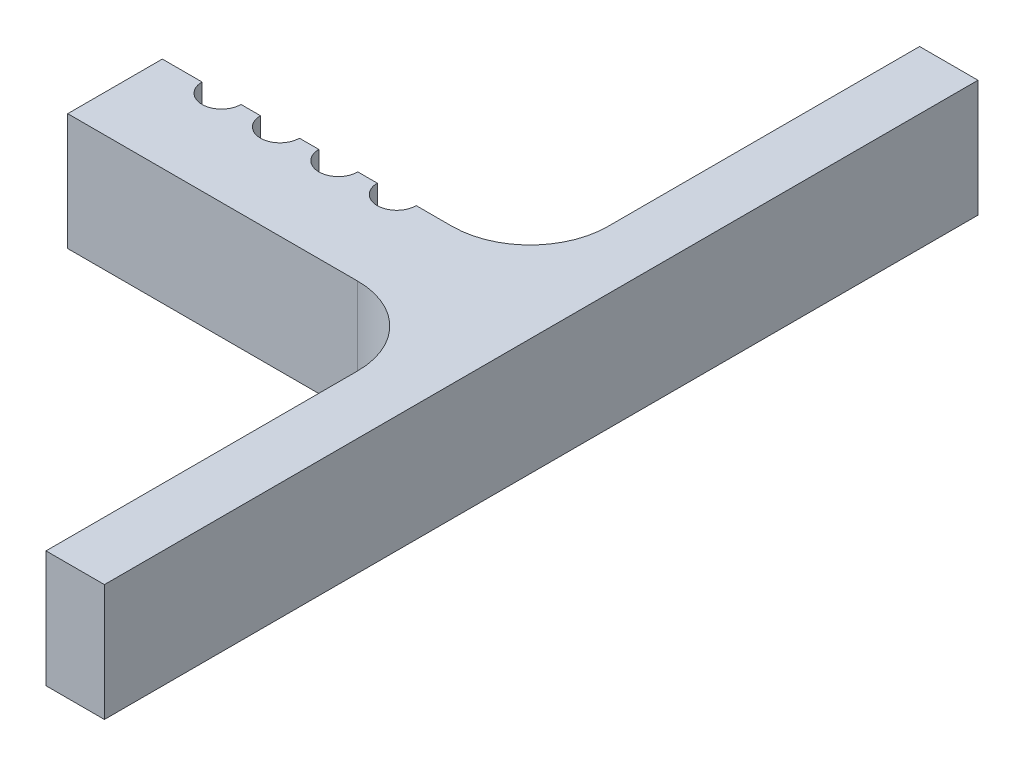
ISO-10303-21;
HEADER;
FILE_DESCRIPTION(('STEP AP214'),'2;1');
FILE_NAME('part.step','',(''),(''),'','','');
FILE_SCHEMA(('AUTOMOTIVE_DESIGN { 1 0 10303 214 1 1 1 1 }'));
ENDSEC;
DATA;
#1=APPLICATION_CONTEXT('core data for automotive mechanical design processes');
#2=APPLICATION_PROTOCOL_DEFINITION('international standard','automotive_design',2000,#1);
#3=PRODUCT_CONTEXT('',#1,'mechanical');
#4=PRODUCT('Part','Part','',(#3));
#5=PRODUCT_RELATED_PRODUCT_CATEGORY('part','',(#4));
#6=PRODUCT_DEFINITION_FORMATION('','',#4);
#7=PRODUCT_DEFINITION_CONTEXT('part definition',#1,'design');
#8=PRODUCT_DEFINITION('design','',#6,#7);
#9=PRODUCT_DEFINITION_SHAPE('','',#8);
#10=(LENGTH_UNIT() NAMED_UNIT(*) SI_UNIT(.MILLI.,.METRE.));
#11=(NAMED_UNIT(*) PLANE_ANGLE_UNIT() SI_UNIT($,.RADIAN.));
#12=(NAMED_UNIT(*) SI_UNIT($,.STERADIAN.) SOLID_ANGLE_UNIT());
#13=UNCERTAINTY_MEASURE_WITH_UNIT(LENGTH_MEASURE(1.E-05),#10,'distance_accuracy_value','');
#14=(GEOMETRIC_REPRESENTATION_CONTEXT(3) GLOBAL_UNCERTAINTY_ASSIGNED_CONTEXT((#13)) GLOBAL_UNIT_ASSIGNED_CONTEXT((#10,
#11,#12)) REPRESENTATION_CONTEXT('',''));
#15=CARTESIAN_POINT('',(0.,0.,0.));
#16=DIRECTION('',(0.,0.,1.));
#17=DIRECTION('',(1.,0.,0.));
#18=AXIS2_PLACEMENT_3D('',#15,#16,#17);
#19=CARTESIAN_POINT('',(0.,1.5,-10.2213378490945));
#20=DIRECTION('',(0.,0.,-1.));
#21=DIRECTION('',(-1.,0.,0.));
#22=AXIS2_PLACEMENT_3D('',#19,#20,#21);
#23=PLANE('',#22);
#24=DIRECTION('',(1.,0.,0.));
#25=VECTOR('',#24,1.);
#26=CARTESIAN_POINT('',(0.,1.5,-10.2213378490945));
#27=LINE('',#26,#25);
#28=CARTESIAN_POINT('',(-43.5465527936732,1.5,-10.2213378490945));
#29=VERTEX_POINT('',#28);
#30=CARTESIAN_POINT('',(-43.0852713193559,1.5,-10.2213378490945));
#31=VERTEX_POINT('',#30);
#32=EDGE_CURVE('E185',#29,#31,#27,.T.);
#33=ORIENTED_EDGE('',*,*,#32,.T.);
#34=DIRECTION('',(0.,-1.,0.));
#35=VECTOR('',#34,1.);
#36=CARTESIAN_POINT('',(-43.0852713193559,0.,-10.2213378490945));
#37=LINE('',#36,#35);
#38=CARTESIAN_POINT('',(-43.0852713193559,0.,-10.2213378490945));
#39=VERTEX_POINT('',#38);
#40=EDGE_CURVE('E247',#31,#39,#37,.T.);
#41=ORIENTED_EDGE('',*,*,#40,.T.);
#42=DIRECTION('',(1.,0.,0.));
#43=VECTOR('',#42,1.);
#44=CARTESIAN_POINT('',(0.,0.,-10.2213378490945));
#45=LINE('',#44,#43);
#46=CARTESIAN_POINT('',(-43.5465527936732,0.,-10.2213378490945));
#47=VERTEX_POINT('',#46);
#48=EDGE_CURVE('E56',#47,#39,#45,.T.);
#49=ORIENTED_EDGE('',*,*,#48,.F.);
#50=DIRECTION('',(0.,1.,0.));
#51=VECTOR('',#50,1.);
#52=CARTESIAN_POINT('',(-43.5465527936732,-0.5,-10.2213378490945));
#53=LINE('',#52,#51);
#54=EDGE_CURVE('E42',#47,#29,#53,.T.);
#55=ORIENTED_EDGE('',*,*,#54,.T.);
#56=EDGE_LOOP('',(#33,#41,#49,#55));
#57=FACE_BOUND('',#56,.T.);
#58=ADVANCED_FACE('F34',(#57),#23,.T.);
#59=CARTESIAN_POINT('',(-43.7965527936732,-0.5,-10.2213378490945));
#60=DIRECTION('',(0.,1.,0.));
#61=DIRECTION('',(0.,0.,1.));
#62=AXIS2_PLACEMENT_3D('',#59,#60,#61);
#63=CYLINDRICAL_SURFACE('',#62,0.25);
#64=DIRECTION('',(0.,1.,0.));
#65=VECTOR('',#64,1.);
#66=CARTESIAN_POINT('',(-44.0465527936732,-0.5,-10.2213378490945));
#67=LINE('',#66,#65);
#68=CARTESIAN_POINT('',(-44.0465527936732,0.,-10.2213378490945));
#69=VERTEX_POINT('',#68);
#70=CARTESIAN_POINT('',(-44.0465527936732,1.5,-10.2213378490945));
#71=VERTEX_POINT('',#70);
#72=EDGE_CURVE('E194',#69,#71,#67,.T.);
#73=ORIENTED_EDGE('',*,*,#72,.T.);
#74=CARTESIAN_POINT('',(-43.7965527936732,1.5,-10.2213378490945));
#75=DIRECTION('',(0.,1.,0.));
#76=DIRECTION('',(0.,0.,1.));
#77=AXIS2_PLACEMENT_3D('',#74,#75,#76);
#78=CIRCLE('',#77,0.25);
#79=EDGE_CURVE('E233',#71,#29,#78,.T.);
#80=ORIENTED_EDGE('',*,*,#79,.T.);
#81=ORIENTED_EDGE('',*,*,#54,.F.);
#82=CARTESIAN_POINT('',(-43.7965527936732,0.,-10.2213378490945));
#83=DIRECTION('',(0.,1.,0.));
#84=DIRECTION('',(0.,0.,1.));
#85=AXIS2_PLACEMENT_3D('',#82,#83,#84);
#86=CIRCLE('',#85,0.25);
#87=EDGE_CURVE('E11',#69,#47,#86,.T.);
#88=ORIENTED_EDGE('',*,*,#87,.F.);
#89=EDGE_LOOP('',(#73,#80,#81,#88));
#90=FACE_BOUND('',#89,.T.);
#91=ADVANCED_FACE('F36',(#90),#63,.F.);
#92=CARTESIAN_POINT('',(-44.2965527936732,1.5,-10.2213378490945));
#93=VERTEX_POINT('',#92);
#94=EDGE_CURVE('E192',#93,#71,#27,.T.);
#95=ORIENTED_EDGE('',*,*,#94,.T.);
#96=ORIENTED_EDGE('',*,*,#72,.F.);
#97=CARTESIAN_POINT('',(-44.2965527936732,0.,-10.2213378490945));
#98=VERTEX_POINT('',#97);
#99=EDGE_CURVE('E48',#98,#69,#45,.T.);
#100=ORIENTED_EDGE('',*,*,#99,.F.);
#101=DIRECTION('',(0.,1.,0.));
#102=VECTOR('',#101,1.);
#103=CARTESIAN_POINT('',(-44.2965527936732,-0.5,-10.2213378490945));
#104=LINE('',#103,#102);
#105=EDGE_CURVE('E197',#98,#93,#104,.T.);
#106=ORIENTED_EDGE('',*,*,#105,.T.);
#107=EDGE_LOOP('',(#95,#96,#100,#106));
#108=FACE_BOUND('',#107,.T.);
#109=ADVANCED_FACE('F349',(#108),#23,.T.);
#110=CARTESIAN_POINT('',(-44.5465527936732,-0.5,-10.2213378490945));
#111=DIRECTION('',(0.,1.,0.));
#112=DIRECTION('',(0.,0.,1.));
#113=AXIS2_PLACEMENT_3D('',#110,#111,#112);
#114=CYLINDRICAL_SURFACE('',#113,0.25);
#115=DIRECTION('',(0.,1.,0.));
#116=VECTOR('',#115,1.);
#117=CARTESIAN_POINT('',(-44.7965527936732,-0.5,-10.2213378490945));
#118=LINE('',#117,#116);
#119=CARTESIAN_POINT('',(-44.7965527936732,0.,-10.2213378490945));
#120=VERTEX_POINT('',#119);
#121=CARTESIAN_POINT('',(-44.7965527936732,1.5,-10.2213378490945));
#122=VERTEX_POINT('',#121);
#123=EDGE_CURVE('E203',#120,#122,#118,.T.);
#124=ORIENTED_EDGE('',*,*,#123,.T.);
#125=CARTESIAN_POINT('',(-44.5465527936732,1.5,-10.2213378490945));
#126=DIRECTION('',(0.,1.,0.));
#127=DIRECTION('',(0.,0.,1.));
#128=AXIS2_PLACEMENT_3D('',#125,#126,#127);
#129=CIRCLE('',#128,0.25);
#130=EDGE_CURVE('E228',#122,#93,#129,.T.);
#131=ORIENTED_EDGE('',*,*,#130,.T.);
#132=ORIENTED_EDGE('',*,*,#105,.F.);
#133=CARTESIAN_POINT('',(-44.5465527936732,0.,-10.2213378490945));
#134=DIRECTION('',(0.,1.,0.));
#135=DIRECTION('',(0.,0.,1.));
#136=AXIS2_PLACEMENT_3D('',#133,#134,#135);
#137=CIRCLE('',#136,0.25);
#138=EDGE_CURVE('E191',#120,#98,#137,.T.);
#139=ORIENTED_EDGE('',*,*,#138,.F.);
#140=EDGE_LOOP('',(#124,#131,#132,#139));
#141=FACE_BOUND('',#140,.T.);
#142=ADVANCED_FACE('F356',(#141),#114,.F.);
#143=CARTESIAN_POINT('',(-45.0465527936732,1.5,-10.2213378490945));
#144=VERTEX_POINT('',#143);
#145=EDGE_CURVE('E189',#144,#122,#27,.T.);
#146=ORIENTED_EDGE('',*,*,#145,.T.);
#147=ORIENTED_EDGE('',*,*,#123,.F.);
#148=CARTESIAN_POINT('',(-45.0465527936732,0.,-10.2213378490945));
#149=VERTEX_POINT('',#148);
#150=EDGE_CURVE('E204',#149,#120,#45,.T.);
#151=ORIENTED_EDGE('',*,*,#150,.F.);
#152=DIRECTION('',(0.,1.,0.));
#153=VECTOR('',#152,1.);
#154=CARTESIAN_POINT('',(-45.0465527936732,-0.5,-10.2213378490945));
#155=LINE('',#154,#153);
#156=EDGE_CURVE('E206',#149,#144,#155,.T.);
#157=ORIENTED_EDGE('',*,*,#156,.T.);
#158=EDGE_LOOP('',(#146,#147,#151,#157));
#159=FACE_BOUND('',#158,.T.);
#160=ADVANCED_FACE('F346',(#159),#23,.T.);
#161=CARTESIAN_POINT('',(-45.2965527936732,-0.5,-10.2213378490945));
#162=DIRECTION('',(0.,1.,0.));
#163=DIRECTION('',(0.,0.,1.));
#164=AXIS2_PLACEMENT_3D('',#161,#162,#163);
#165=CYLINDRICAL_SURFACE('',#164,0.25);
#166=DIRECTION('',(0.,1.,0.));
#167=VECTOR('',#166,1.);
#168=CARTESIAN_POINT('',(-45.5465527936732,-0.5,-10.2213378490945));
#169=LINE('',#168,#167);
#170=CARTESIAN_POINT('',(-45.5465527936732,0.,-10.2213378490945));
#171=VERTEX_POINT('',#170);
#172=CARTESIAN_POINT('',(-45.5465527936732,1.5,-10.2213378490945));
#173=VERTEX_POINT('',#172);
#174=EDGE_CURVE('E212',#171,#173,#169,.T.);
#175=ORIENTED_EDGE('',*,*,#174,.T.);
#176=CARTESIAN_POINT('',(-45.2965527936732,1.5,-10.2213378490945));
#177=DIRECTION('',(0.,1.,0.));
#178=DIRECTION('',(0.,0.,1.));
#179=AXIS2_PLACEMENT_3D('',#176,#177,#178);
#180=CIRCLE('',#179,0.25);
#181=EDGE_CURVE('E223',#173,#144,#180,.T.);
#182=ORIENTED_EDGE('',*,*,#181,.T.);
#183=ORIENTED_EDGE('',*,*,#156,.F.);
#184=CARTESIAN_POINT('',(-45.2965527936732,0.,-10.2213378490945));
#185=DIRECTION('',(0.,1.,0.));
#186=DIRECTION('',(0.,0.,1.));
#187=AXIS2_PLACEMENT_3D('',#184,#185,#186);
#188=CIRCLE('',#187,0.25);
#189=EDGE_CURVE('E199',#171,#149,#188,.T.);
#190=ORIENTED_EDGE('',*,*,#189,.F.);
#191=EDGE_LOOP('',(#175,#182,#183,#190));
#192=FACE_BOUND('',#191,.T.);
#193=ADVANCED_FACE('F343',(#192),#165,.F.);
#194=DIRECTION('',(0.,1.,0.));
#195=VECTOR('',#194,1.);
#196=CARTESIAN_POINT('',(-46.2965527936732,-0.5,-10.2213378490945));
#197=LINE('',#196,#195);
#198=CARTESIAN_POINT('',(-46.2965527936732,0.,-10.2213378490945));
#199=VERTEX_POINT('',#198);
#200=CARTESIAN_POINT('',(-46.2965527936732,1.5,-10.2213378490945));
#201=VERTEX_POINT('',#200);
#202=EDGE_CURVE('E159',#199,#201,#197,.T.);
#203=ORIENTED_EDGE('',*,*,#202,.F.);
#204=CARTESIAN_POINT('',(-46.8065527936732,0.,-10.2213378490945));
#205=VERTEX_POINT('',#204);
#206=EDGE_CURVE('E196',#205,#199,#45,.T.);
#207=ORIENTED_EDGE('',*,*,#206,.F.);
#208=DIRECTION('',(0.,-1.,0.));
#209=VECTOR('',#208,1.);
#210=CARTESIAN_POINT('',(-46.8065527936732,1.5,-10.2213378490945));
#211=LINE('',#210,#209);
#212=CARTESIAN_POINT('',(-46.8065527936732,1.5,-10.2213378490945));
#213=VERTEX_POINT('',#212);
#214=EDGE_CURVE('E181',#213,#205,#211,.T.);
#215=ORIENTED_EDGE('',*,*,#214,.F.);
#216=EDGE_CURVE('E176',#213,#201,#27,.T.);
#217=ORIENTED_EDGE('',*,*,#216,.T.);
#218=EDGE_LOOP('',(#203,#207,#215,#217));
#219=FACE_BOUND('',#218,.T.);
#220=ADVANCED_FACE('F180',(#219),#23,.T.);
#221=CARTESIAN_POINT('',(0.,1.5,-4.00651284909447));
#222=DIRECTION('',(0.,0.,-1.));
#223=DIRECTION('',(-1.,0.,0.));
#224=AXIS2_PLACEMENT_3D('',#221,#222,#223);
#225=PLANE('',#224);
#226=DIRECTION('',(1.,0.,0.));
#227=VECTOR('',#226,1.);
#228=CARTESIAN_POINT('',(0.,0.,-4.00651284909447));
#229=LINE('',#228,#227);
#230=CARTESIAN_POINT('',(-42.0852713193559,0.,-4.00651284909447));
#231=VERTEX_POINT('',#230);
#232=CARTESIAN_POINT('',(-41.3352713193559,0.,-4.00651284909447));
#233=VERTEX_POINT('',#232);
#234=EDGE_CURVE('E310',#231,#233,#229,.T.);
#235=ORIENTED_EDGE('',*,*,#234,.T.);
#236=DIRECTION('',(0.,-1.,0.));
#237=VECTOR('',#236,1.);
#238=CARTESIAN_POINT('',(-41.3352713193559,1.5,-4.00651284909447));
#239=LINE('',#238,#237);
#240=CARTESIAN_POINT('',(-41.3352713193559,1.5,-4.00651284909447));
#241=VERTEX_POINT('',#240);
#242=EDGE_CURVE('E251',#241,#233,#239,.T.);
#243=ORIENTED_EDGE('',*,*,#242,.F.);
#244=DIRECTION('',(1.,0.,0.));
#245=VECTOR('',#244,1.);
#246=CARTESIAN_POINT('',(0.,1.5,-4.00651284909447));
#247=LINE('',#246,#245);
#248=CARTESIAN_POINT('',(-42.0852713193559,1.5,-4.00651284909447));
#249=VERTEX_POINT('',#248);
#250=EDGE_CURVE('E306',#249,#241,#247,.T.);
#251=ORIENTED_EDGE('',*,*,#250,.F.);
#252=DIRECTION('',(0.,-1.,0.));
#253=VECTOR('',#252,1.);
#254=CARTESIAN_POINT('',(-42.0852713193559,1.5,-4.00651284909447));
#255=LINE('',#254,#253);
#256=EDGE_CURVE('E292',#249,#231,#255,.T.);
#257=ORIENTED_EDGE('',*,*,#256,.T.);
#258=EDGE_LOOP('',(#235,#243,#251,#257));
#259=FACE_BOUND('',#258,.T.);
#260=ADVANCED_FACE('F335',(#259),#225,.F.);
#261=CARTESIAN_POINT('',(-41.3352713193559,1.5,0.));
#262=DIRECTION('',(-1.,0.,0.));
#263=DIRECTION('',(0.,0.,1.));
#264=AXIS2_PLACEMENT_3D('',#261,#262,#263);
#265=PLANE('',#264);
#266=DIRECTION('',(0.,0.,-1.));
#267=VECTOR('',#266,1.);
#268=CARTESIAN_POINT('',(-41.3352713193559,0.,0.));
#269=LINE('',#268,#267);
#270=CARTESIAN_POINT('',(-41.3352713193559,0.,-15.2213378490945));
#271=VERTEX_POINT('',#270);
#272=EDGE_CURVE('E313',#233,#271,#269,.T.);
#273=ORIENTED_EDGE('',*,*,#272,.T.);
#274=DIRECTION('',(0.,-1.,0.));
#275=VECTOR('',#274,1.);
#276=CARTESIAN_POINT('',(-41.3352713193559,1.5,-15.2213378490945));
#277=LINE('',#276,#275);
#278=CARTESIAN_POINT('',(-41.3352713193559,1.5,-15.2213378490945));
#279=VERTEX_POINT('',#278);
#280=EDGE_CURVE('E255',#279,#271,#277,.T.);
#281=ORIENTED_EDGE('',*,*,#280,.F.);
#282=DIRECTION('',(0.,0.,-1.));
#283=VECTOR('',#282,1.);
#284=CARTESIAN_POINT('',(-41.3352713193559,1.5,0.));
#285=LINE('',#284,#283);
#286=EDGE_CURVE('E303',#241,#279,#285,.T.);
#287=ORIENTED_EDGE('',*,*,#286,.F.);
#288=ORIENTED_EDGE('',*,*,#242,.T.);
#289=EDGE_LOOP('',(#273,#281,#287,#288));
#290=FACE_BOUND('',#289,.T.);
#291=ADVANCED_FACE('F333',(#290),#265,.F.);
#292=CARTESIAN_POINT('',(0.,1.5,-15.2213378490945));
#293=DIRECTION('',(0.,0.,-1.));
#294=DIRECTION('',(-1.,0.,0.));
#295=AXIS2_PLACEMENT_3D('',#292,#293,#294);
#296=PLANE('',#295);
#297=DIRECTION('',(1.,0.,0.));
#298=VECTOR('',#297,1.);
#299=CARTESIAN_POINT('',(0.,0.,-15.2213378490945));
#300=LINE('',#299,#298);
#301=CARTESIAN_POINT('',(-42.0852713193559,0.,-15.2213378490945));
#302=VERTEX_POINT('',#301);
#303=EDGE_CURVE('E318',#302,#271,#300,.T.);
#304=ORIENTED_EDGE('',*,*,#303,.F.);
#305=DIRECTION('',(0.,-1.,0.));
#306=VECTOR('',#305,1.);
#307=CARTESIAN_POINT('',(-42.0852713193559,1.5,-15.2213378490945));
#308=LINE('',#307,#306);
#309=CARTESIAN_POINT('',(-42.0852713193559,1.5,-15.2213378490945));
#310=VERTEX_POINT('',#309);
#311=EDGE_CURVE('E328',#310,#302,#308,.T.);
#312=ORIENTED_EDGE('',*,*,#311,.F.);
#313=DIRECTION('',(1.,0.,0.));
#314=VECTOR('',#313,1.);
#315=CARTESIAN_POINT('',(0.,1.5,-15.2213378490945));
#316=LINE('',#315,#314);
#317=EDGE_CURVE('E297',#310,#279,#316,.T.);
#318=ORIENTED_EDGE('',*,*,#317,.T.);
#319=ORIENTED_EDGE('',*,*,#280,.T.);
#320=EDGE_LOOP('',(#304,#312,#318,#319));
#321=FACE_BOUND('',#320,.T.);
#322=ADVANCED_FACE('F331',(#321),#296,.T.);
#323=CARTESIAN_POINT('',(-42.0852713193559,1.5,0.));
#324=DIRECTION('',(-1.,0.,0.));
#325=DIRECTION('',(0.,0.,1.));
#326=AXIS2_PLACEMENT_3D('',#323,#324,#325);
#327=PLANE('',#326);
#328=DIRECTION('',(0.,0.,-1.));
#329=VECTOR('',#328,1.);
#330=CARTESIAN_POINT('',(-42.0852713193559,0.,0.));
#331=LINE('',#330,#329);
#332=CARTESIAN_POINT('',(-42.0852713193559,0.,-11.2213378490945));
#333=VERTEX_POINT('',#332);
#334=EDGE_CURVE('E323',#333,#302,#331,.T.);
#335=ORIENTED_EDGE('',*,*,#334,.F.);
#336=DIRECTION('',(0.,-1.,0.));
#337=VECTOR('',#336,1.);
#338=CARTESIAN_POINT('',(-42.0852713193559,1.5,-11.2213378490945));
#339=LINE('',#338,#337);
#340=CARTESIAN_POINT('',(-42.0852713193559,1.5,-11.2213378490945));
#341=VERTEX_POINT('',#340);
#342=EDGE_CURVE('E248',#333,#341,#339,.F.);
#343=ORIENTED_EDGE('',*,*,#342,.T.);
#344=DIRECTION('',(0.,0.,-1.));
#345=VECTOR('',#344,1.);
#346=CARTESIAN_POINT('',(-42.0852713193559,1.5,0.));
#347=LINE('',#346,#345);
#348=EDGE_CURVE('E188',#341,#310,#347,.T.);
#349=ORIENTED_EDGE('',*,*,#348,.T.);
#350=ORIENTED_EDGE('',*,*,#311,.T.);
#351=EDGE_LOOP('',(#335,#343,#349,#350));
#352=FACE_BOUND('',#351,.T.);
#353=ADVANCED_FACE('F334',(#352),#327,.T.);
#354=CARTESIAN_POINT('',(-45.7965527936732,1.5,-10.2213378490945));
#355=VERTEX_POINT('',#354);
#356=EDGE_CURVE('E178',#355,#173,#27,.T.);
#357=ORIENTED_EDGE('',*,*,#356,.T.);
#358=ORIENTED_EDGE('',*,*,#174,.F.);
#359=CARTESIAN_POINT('',(-45.7965527936732,0.,-10.2213378490945));
#360=VERTEX_POINT('',#359);
#361=EDGE_CURVE('E213',#360,#171,#45,.T.);
#362=ORIENTED_EDGE('',*,*,#361,.F.);
#363=DIRECTION('',(0.,1.,0.));
#364=VECTOR('',#363,1.);
#365=CARTESIAN_POINT('',(-45.7965527936732,-0.5,-10.2213378490945));
#366=LINE('',#365,#364);
#367=EDGE_CURVE('E170',#360,#355,#366,.T.);
#368=ORIENTED_EDGE('',*,*,#367,.T.);
#369=EDGE_LOOP('',(#357,#358,#362,#368));
#370=FACE_BOUND('',#369,.T.);
#371=ADVANCED_FACE('F345',(#370),#23,.T.);
#372=CARTESIAN_POINT('',(-46.8065527936732,1.5,0.));
#373=DIRECTION('',(1.,0.,0.));
#374=DIRECTION('',(0.,0.,-1.));
#375=AXIS2_PLACEMENT_3D('',#372,#373,#374);
#376=PLANE('',#375);
#377=DIRECTION('',(0.,0.,1.));
#378=VECTOR('',#377,1.);
#379=CARTESIAN_POINT('',(-46.8065527936732,0.,0.));
#380=LINE('',#379,#378);
#381=CARTESIAN_POINT('',(-46.8065527936732,0.,-9.00651284909447));
#382=VERTEX_POINT('',#381);
#383=EDGE_CURVE('E282',#205,#382,#380,.T.);
#384=ORIENTED_EDGE('',*,*,#383,.T.);
#385=DIRECTION('',(0.,-1.,0.));
#386=VECTOR('',#385,1.);
#387=CARTESIAN_POINT('',(-46.8065527936732,1.5,-9.00651284909447));
#388=LINE('',#387,#386);
#389=CARTESIAN_POINT('',(-46.8065527936732,1.5,-9.00651284909447));
#390=VERTEX_POINT('',#389);
#391=EDGE_CURVE('E281',#390,#382,#388,.T.);
#392=ORIENTED_EDGE('',*,*,#391,.F.);
#393=DIRECTION('',(0.,0.,1.));
#394=VECTOR('',#393,1.);
#395=CARTESIAN_POINT('',(-46.8065527936732,1.5,0.));
#396=LINE('',#395,#394);
#397=EDGE_CURVE('E183',#213,#390,#396,.T.);
#398=ORIENTED_EDGE('',*,*,#397,.F.);
#399=ORIENTED_EDGE('',*,*,#214,.T.);
#400=EDGE_LOOP('',(#384,#392,#398,#399));
#401=FACE_BOUND('',#400,.T.);
#402=ADVANCED_FACE('F358',(#401),#376,.F.);
#403=CARTESIAN_POINT('',(0.,1.5,-9.00651284909447));
#404=DIRECTION('',(0.,0.,-1.));
#405=DIRECTION('',(-1.,0.,0.));
#406=AXIS2_PLACEMENT_3D('',#403,#404,#405);
#407=PLANE('',#406);
#408=DIRECTION('',(1.,0.,0.));
#409=VECTOR('',#408,1.);
#410=CARTESIAN_POINT('',(0.,0.,-9.00651284909447));
#411=LINE('',#410,#409);
#412=CARTESIAN_POINT('',(-43.0852713193559,0.,-9.00651284909447));
#413=VERTEX_POINT('',#412);
#414=EDGE_CURVE('E268',#382,#413,#411,.T.);
#415=ORIENTED_EDGE('',*,*,#414,.T.);
#416=DIRECTION('',(0.,-1.,0.));
#417=VECTOR('',#416,1.);
#418=CARTESIAN_POINT('',(-43.0852713193559,1.5,-9.00651284909447));
#419=LINE('',#418,#417);
#420=CARTESIAN_POINT('',(-43.0852713193559,1.5,-9.00651284909447));
#421=VERTEX_POINT('',#420);
#422=EDGE_CURVE('E263',#413,#421,#419,.F.);
#423=ORIENTED_EDGE('',*,*,#422,.T.);
#424=DIRECTION('',(1.,0.,0.));
#425=VECTOR('',#424,1.);
#426=CARTESIAN_POINT('',(0.,1.5,-9.00651284909447));
#427=LINE('',#426,#425);
#428=EDGE_CURVE('E186',#390,#421,#427,.T.);
#429=ORIENTED_EDGE('',*,*,#428,.F.);
#430=ORIENTED_EDGE('',*,*,#391,.T.);
#431=EDGE_LOOP('',(#415,#423,#429,#430));
#432=FACE_BOUND('',#431,.T.);
#433=ADVANCED_FACE('F277',(#432),#407,.F.);
#434=CARTESIAN_POINT('',(-42.0852713193559,1.5,-8.00651284909446));
#435=VERTEX_POINT('',#434);
#436=EDGE_CURVE('E289',#249,#435,#347,.T.);
#437=ORIENTED_EDGE('',*,*,#436,.T.);
#438=DIRECTION('',(0.,-1.,0.));
#439=VECTOR('',#438,1.);
#440=CARTESIAN_POINT('',(-42.0852713193559,1.5,-8.00651284909446));
#441=LINE('',#440,#439);
#442=CARTESIAN_POINT('',(-42.0852713193559,0.,-8.00651284909446));
#443=VERTEX_POINT('',#442);
#444=EDGE_CURVE('E260',#435,#443,#441,.T.);
#445=ORIENTED_EDGE('',*,*,#444,.T.);
#446=EDGE_CURVE('E271',#231,#443,#331,.T.);
#447=ORIENTED_EDGE('',*,*,#446,.F.);
#448=ORIENTED_EDGE('',*,*,#256,.F.);
#449=EDGE_LOOP('',(#437,#445,#447,#448));
#450=FACE_BOUND('',#449,.T.);
#451=ADVANCED_FACE('F291',(#450),#327,.T.);
#452=CARTESIAN_POINT('',(0.,1.5,0.));
#453=DIRECTION('',(0.,1.,0.));
#454=DIRECTION('',(0.,0.,1.));
#455=AXIS2_PLACEMENT_3D('',#452,#453,#454);
#456=PLANE('',#455);
#457=ORIENTED_EDGE('',*,*,#94,.F.);
#458=ORIENTED_EDGE('',*,*,#130,.F.);
#459=ORIENTED_EDGE('',*,*,#145,.F.);
#460=ORIENTED_EDGE('',*,*,#181,.F.);
#461=ORIENTED_EDGE('',*,*,#356,.F.);
#462=CARTESIAN_POINT('',(-46.0465527936732,1.5,-10.2213378490945));
#463=DIRECTION('',(0.,1.,0.));
#464=DIRECTION('',(0.,0.,1.));
#465=AXIS2_PLACEMENT_3D('',#462,#463,#464);
#466=CIRCLE('',#465,0.25);
#467=EDGE_CURVE('E162',#201,#355,#466,.T.);
#468=ORIENTED_EDGE('',*,*,#467,.F.);
#469=ORIENTED_EDGE('',*,*,#216,.F.);
#470=ORIENTED_EDGE('',*,*,#397,.T.);
#471=ORIENTED_EDGE('',*,*,#428,.T.);
#472=CARTESIAN_POINT('',(-43.0852713193559,1.5,-8.00651284909446));
#473=DIRECTION('',(0.,1.,0.));
#474=DIRECTION('',(0.,0.,1.));
#475=AXIS2_PLACEMENT_3D('',#472,#473,#474);
#476=CIRCLE('',#475,1.);
#477=EDGE_CURVE('E214',#421,#435,#476,.F.);
#478=ORIENTED_EDGE('',*,*,#477,.T.);
#479=ORIENTED_EDGE('',*,*,#436,.F.);
#480=ORIENTED_EDGE('',*,*,#250,.T.);
#481=ORIENTED_EDGE('',*,*,#286,.T.);
#482=ORIENTED_EDGE('',*,*,#317,.F.);
#483=ORIENTED_EDGE('',*,*,#348,.F.);
#484=CARTESIAN_POINT('',(-43.0852713193559,1.5,-11.2213378490945));
#485=DIRECTION('',(0.,1.,0.));
#486=DIRECTION('',(0.,0.,1.));
#487=AXIS2_PLACEMENT_3D('',#484,#485,#486);
#488=CIRCLE('',#487,1.);
#489=EDGE_CURVE('E249',#341,#31,#488,.F.);
#490=ORIENTED_EDGE('',*,*,#489,.T.);
#491=ORIENTED_EDGE('',*,*,#32,.F.);
#492=ORIENTED_EDGE('',*,*,#79,.F.);
#493=EDGE_LOOP('',(#457,#458,#459,#460,#461,#468,#469,#470,#471,#478,#479,#480,#481,#482,#483,
#490,#491,#492));
#494=FACE_BOUND('',#493,.T.);
#495=ADVANCED_FACE('F175',(#494),#456,.T.);
#496=CARTESIAN_POINT('',(0.,0.,0.));
#497=DIRECTION('',(0.,1.,0.));
#498=DIRECTION('',(0.,0.,1.));
#499=AXIS2_PLACEMENT_3D('',#496,#497,#498);
#500=PLANE('',#499);
#501=ORIENTED_EDGE('',*,*,#99,.T.);
#502=ORIENTED_EDGE('',*,*,#87,.T.);
#503=ORIENTED_EDGE('',*,*,#48,.T.);
#504=CARTESIAN_POINT('',(-43.0852713193559,0.,-11.2213378490945));
#505=DIRECTION('',(0.,1.,0.));
#506=DIRECTION('',(0.,0.,1.));
#507=AXIS2_PLACEMENT_3D('',#504,#505,#506);
#508=CIRCLE('',#507,1.);
#509=EDGE_CURVE('E240',#39,#333,#508,.T.);
#510=ORIENTED_EDGE('',*,*,#509,.T.);
#511=ORIENTED_EDGE('',*,*,#334,.T.);
#512=ORIENTED_EDGE('',*,*,#303,.T.);
#513=ORIENTED_EDGE('',*,*,#272,.F.);
#514=ORIENTED_EDGE('',*,*,#234,.F.);
#515=ORIENTED_EDGE('',*,*,#446,.T.);
#516=CARTESIAN_POINT('',(-43.0852713193559,0.,-8.00651284909446));
#517=DIRECTION('',(0.,1.,0.));
#518=DIRECTION('',(0.,0.,1.));
#519=AXIS2_PLACEMENT_3D('',#516,#517,#518);
#520=CIRCLE('',#519,1.);
#521=EDGE_CURVE('E217',#443,#413,#520,.T.);
#522=ORIENTED_EDGE('',*,*,#521,.T.);
#523=ORIENTED_EDGE('',*,*,#414,.F.);
#524=ORIENTED_EDGE('',*,*,#383,.F.);
#525=ORIENTED_EDGE('',*,*,#206,.T.);
#526=CARTESIAN_POINT('',(-46.0465527936732,0.,-10.2213378490945));
#527=DIRECTION('',(0.,1.,0.));
#528=DIRECTION('',(0.,0.,1.));
#529=AXIS2_PLACEMENT_3D('',#526,#527,#528);
#530=CIRCLE('',#529,0.25);
#531=EDGE_CURVE('E165',#199,#360,#530,.T.);
#532=ORIENTED_EDGE('',*,*,#531,.T.);
#533=ORIENTED_EDGE('',*,*,#361,.T.);
#534=ORIENTED_EDGE('',*,*,#189,.T.);
#535=ORIENTED_EDGE('',*,*,#150,.T.);
#536=ORIENTED_EDGE('',*,*,#138,.T.);
#537=EDGE_LOOP('',(#501,#502,#503,#510,#511,#512,#513,#514,#515,#522,#523,#524,#525,#532,#533,
#534,#535,#536));
#538=FACE_BOUND('',#537,.T.);
#539=ADVANCED_FACE('F238',(#538),#500,.F.);
#540=CARTESIAN_POINT('',(-43.0852713193559,1.5,-11.2213378490945));
#541=DIRECTION('',(0.,1.,0.));
#542=DIRECTION('',(0.,0.,1.));
#543=AXIS2_PLACEMENT_3D('',#540,#541,#542);
#544=CYLINDRICAL_SURFACE('',#543,1.);
#545=ORIENTED_EDGE('',*,*,#489,.F.);
#546=ORIENTED_EDGE('',*,*,#342,.F.);
#547=ORIENTED_EDGE('',*,*,#509,.F.);
#548=ORIENTED_EDGE('',*,*,#40,.F.);
#549=EDGE_LOOP('',(#545,#546,#547,#548));
#550=FACE_BOUND('',#549,.T.);
#551=ADVANCED_FACE('F246',(#550),#544,.F.);
#552=CARTESIAN_POINT('',(-43.0852713193559,1.5,-8.00651284909446));
#553=DIRECTION('',(0.,-1.,0.));
#554=DIRECTION('',(0.,0.,-1.));
#555=AXIS2_PLACEMENT_3D('',#552,#553,#554);
#556=CYLINDRICAL_SURFACE('',#555,1.);
#557=ORIENTED_EDGE('',*,*,#477,.F.);
#558=ORIENTED_EDGE('',*,*,#422,.F.);
#559=ORIENTED_EDGE('',*,*,#521,.F.);
#560=ORIENTED_EDGE('',*,*,#444,.F.);
#561=EDGE_LOOP('',(#557,#558,#559,#560));
#562=FACE_BOUND('',#561,.T.);
#563=ADVANCED_FACE('F285',(#562),#556,.F.);
#564=CARTESIAN_POINT('',(-46.0465527936732,-0.5,-10.2213378490945));
#565=DIRECTION('',(0.,1.,0.));
#566=DIRECTION('',(0.,0.,1.));
#567=AXIS2_PLACEMENT_3D('',#564,#565,#566);
#568=CYLINDRICAL_SURFACE('',#567,0.25);
#569=ORIENTED_EDGE('',*,*,#202,.T.);
#570=ORIENTED_EDGE('',*,*,#467,.T.);
#571=ORIENTED_EDGE('',*,*,#367,.F.);
#572=ORIENTED_EDGE('',*,*,#531,.F.);
#573=EDGE_LOOP('',(#569,#570,#571,#572));
#574=FACE_BOUND('',#573,.T.);
#575=ADVANCED_FACE('F161',(#574),#568,.F.);
#576=CLOSED_SHELL('',(#58,#91,#109,#142,#160,#193,#220,#260,#291,#322,#353,#371,#402,#433,#451,
#495,#539,#551,#563,#575));
#577=MANIFOLD_SOLID_BREP('B2',#576);
#578=ADVANCED_BREP_SHAPE_REPRESENTATION('',(#18,#577),#14);
#579=SHAPE_DEFINITION_REPRESENTATION(#9,#578);
ENDSEC;
END-ISO-10303-21;
